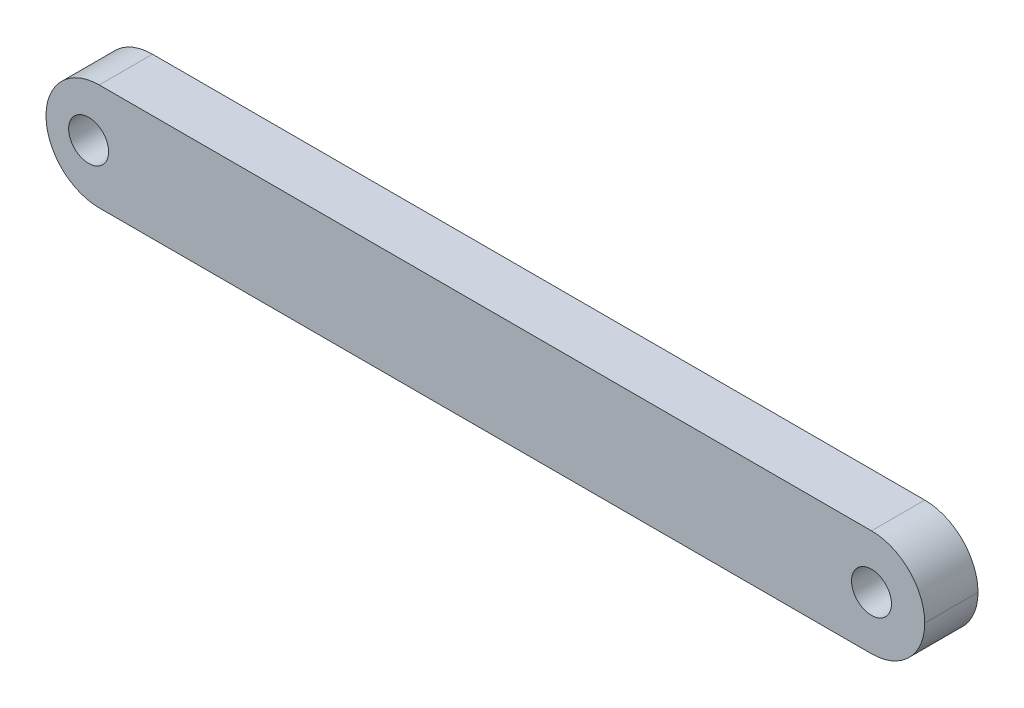
ISO-10303-21;
HEADER;
FILE_DESCRIPTION(('STEP AP214'),'2;1');
FILE_NAME('part.step','',(''),(''),'','','');
FILE_SCHEMA(('AUTOMOTIVE_DESIGN { 1 0 10303 214 1 1 1 1 }'));
ENDSEC;
DATA;
#1=APPLICATION_CONTEXT('core data for automotive mechanical design processes');
#2=APPLICATION_PROTOCOL_DEFINITION('international standard','automotive_design',2000,#1);
#3=PRODUCT_CONTEXT('',#1,'mechanical');
#4=PRODUCT('Part','Part','',(#3));
#5=PRODUCT_RELATED_PRODUCT_CATEGORY('part','',(#4));
#6=PRODUCT_DEFINITION_FORMATION('','',#4);
#7=PRODUCT_DEFINITION_CONTEXT('part definition',#1,'design');
#8=PRODUCT_DEFINITION('design','',#6,#7);
#9=PRODUCT_DEFINITION_SHAPE('','',#8);
#10=(LENGTH_UNIT() NAMED_UNIT(*) SI_UNIT(.MILLI.,.METRE.));
#11=(NAMED_UNIT(*) PLANE_ANGLE_UNIT() SI_UNIT($,.RADIAN.));
#12=(NAMED_UNIT(*) SI_UNIT($,.STERADIAN.) SOLID_ANGLE_UNIT());
#13=UNCERTAINTY_MEASURE_WITH_UNIT(LENGTH_MEASURE(1.E-05),#10,'distance_accuracy_value','');
#14=(GEOMETRIC_REPRESENTATION_CONTEXT(3) GLOBAL_UNCERTAINTY_ASSIGNED_CONTEXT((#13)) GLOBAL_UNIT_ASSIGNED_CONTEXT((#10,
#11,#12)) REPRESENTATION_CONTEXT('',''));
#15=CARTESIAN_POINT('',(0.,0.,0.));
#16=DIRECTION('',(0.,0.,1.));
#17=DIRECTION('',(1.,0.,0.));
#18=AXIS2_PLACEMENT_3D('',#15,#16,#17);
#19=CARTESIAN_POINT('',(104.775,12.7,6.34999999999999));
#20=DIRECTION('',(0.,0.,-1.));
#21=DIRECTION('',(-1.,0.,0.));
#22=AXIS2_PLACEMENT_3D('',#19,#20,#21);
#23=PLANE('',#22);
#24=CARTESIAN_POINT('',(92.075,0.,6.35));
#25=DIRECTION('',(0.,0.,1.));
#26=DIRECTION('',(1.,0.,0.));
#27=AXIS2_PLACEMENT_3D('',#24,#25,#26);
#28=CIRCLE('',#27,4.7625);
#29=CARTESIAN_POINT('',(96.8375,0.,6.35));
#30=VERTEX_POINT('',#29);
#31=EDGE_CURVE('E122',#30,#30,#28,.T.);
#32=ORIENTED_EDGE('',*,*,#31,.F.);
#33=EDGE_LOOP('',(#32));
#34=FACE_BOUND('',#33,.T.);
#35=CARTESIAN_POINT('',(-94.615,0.,6.35));
#36=DIRECTION('',(0.,0.,1.));
#37=DIRECTION('',(1.,0.,0.));
#38=AXIS2_PLACEMENT_3D('',#35,#36,#37);
#39=CIRCLE('',#38,4.7625);
#40=CARTESIAN_POINT('',(-89.8525,0.,6.35));
#41=VERTEX_POINT('',#40);
#42=EDGE_CURVE('E143',#41,#41,#39,.T.);
#43=ORIENTED_EDGE('',*,*,#42,.F.);
#44=EDGE_LOOP('',(#43));
#45=FACE_BOUND('',#44,.T.);
#46=CARTESIAN_POINT('',(-92.075,0.,6.35000000000001));
#47=DIRECTION('',(0.,0.,-1.));
#48=DIRECTION('',(-1.,0.,0.));
#49=AXIS2_PLACEMENT_3D('',#46,#47,#48);
#50=CIRCLE('',#49,12.7);
#51=CARTESIAN_POINT('',(-92.075,12.7,6.35000000000001));
#52=VERTEX_POINT('',#51);
#53=CARTESIAN_POINT('',(-104.775,0.,6.35000000000001));
#54=VERTEX_POINT('',#53);
#55=EDGE_CURVE('E93',#52,#54,#50,.F.);
#56=ORIENTED_EDGE('',*,*,#55,.T.);
#57=CARTESIAN_POINT('',(-92.075,0.,6.35000000000001));
#58=DIRECTION('',(0.,0.,-1.));
#59=DIRECTION('',(-1.,0.,0.));
#60=AXIS2_PLACEMENT_3D('',#57,#58,#59);
#61=CIRCLE('',#60,12.7);
#62=CARTESIAN_POINT('',(-92.075,-12.7,6.35000000000001));
#63=VERTEX_POINT('',#62);
#64=EDGE_CURVE('E88',#54,#63,#61,.F.);
#65=ORIENTED_EDGE('',*,*,#64,.T.);
#66=DIRECTION('',(1.,0.,0.));
#67=VECTOR('',#66,1.);
#68=CARTESIAN_POINT('',(104.775,-12.7,6.34999999999999));
#69=LINE('',#68,#67);
#70=CARTESIAN_POINT('',(92.0749999999999,-12.7,6.34999999999999));
#71=VERTEX_POINT('',#70);
#72=EDGE_CURVE('E90',#63,#71,#69,.T.);
#73=ORIENTED_EDGE('',*,*,#72,.T.);
#74=CARTESIAN_POINT('',(92.0749999999999,0.,6.34999999999999));
#75=DIRECTION('',(0.,0.,-1.));
#76=DIRECTION('',(-1.,0.,0.));
#77=AXIS2_PLACEMENT_3D('',#74,#75,#76);
#78=CIRCLE('',#77,12.7);
#79=CARTESIAN_POINT('',(104.775,0.,6.34999999999999));
#80=VERTEX_POINT('',#79);
#81=EDGE_CURVE('E157',#71,#80,#78,.F.);
#82=ORIENTED_EDGE('',*,*,#81,.T.);
#83=CARTESIAN_POINT('',(92.0749999999999,0.,6.34999999999999));
#84=DIRECTION('',(0.,0.,-1.));
#85=DIRECTION('',(-1.,0.,0.));
#86=AXIS2_PLACEMENT_3D('',#83,#84,#85);
#87=CIRCLE('',#86,12.7);
#88=CARTESIAN_POINT('',(92.0749999999999,12.7,6.34999999999999));
#89=VERTEX_POINT('',#88);
#90=EDGE_CURVE('E153',#80,#89,#87,.F.);
#91=ORIENTED_EDGE('',*,*,#90,.T.);
#92=DIRECTION('',(1.,0.,0.));
#93=VECTOR('',#92,1.);
#94=CARTESIAN_POINT('',(104.775,12.7,6.34999999999999));
#95=LINE('',#94,#93);
#96=EDGE_CURVE('E149',#52,#89,#95,.T.);
#97=ORIENTED_EDGE('',*,*,#96,.F.);
#98=EDGE_LOOP('',(#56,#65,#73,#82,#91,#97));
#99=FACE_BOUND('',#98,.T.);
#100=ADVANCED_FACE('F34',(#34,#45,#99),#23,.F.);
#101=CARTESIAN_POINT('',(104.775,12.7,-6.35000000000001));
#102=DIRECTION('',(0.,0.,1.));
#103=DIRECTION('',(1.,0.,0.));
#104=AXIS2_PLACEMENT_3D('',#101,#102,#103);
#105=PLANE('',#104);
#106=CARTESIAN_POINT('',(92.075,0.,-6.35000000000001));
#107=DIRECTION('',(0.,0.,1.));
#108=DIRECTION('',(1.,0.,0.));
#109=AXIS2_PLACEMENT_3D('',#106,#107,#108);
#110=CIRCLE('',#109,4.7625);
#111=CARTESIAN_POINT('',(96.8375,0.,-6.35000000000001));
#112=VERTEX_POINT('',#111);
#113=EDGE_CURVE('E124',#112,#112,#110,.T.);
#114=ORIENTED_EDGE('',*,*,#113,.T.);
#115=EDGE_LOOP('',(#114));
#116=FACE_BOUND('',#115,.T.);
#117=CARTESIAN_POINT('',(-94.615,0.,-6.35000000000001));
#118=DIRECTION('',(0.,0.,1.));
#119=DIRECTION('',(1.,0.,0.));
#120=AXIS2_PLACEMENT_3D('',#117,#118,#119);
#121=CIRCLE('',#120,4.7625);
#122=CARTESIAN_POINT('',(-89.8525,0.,-6.35000000000001));
#123=VERTEX_POINT('',#122);
#124=EDGE_CURVE('E109',#123,#123,#121,.T.);
#125=ORIENTED_EDGE('',*,*,#124,.T.);
#126=EDGE_LOOP('',(#125));
#127=FACE_BOUND('',#126,.T.);
#128=DIRECTION('',(-1.,0.,0.));
#129=VECTOR('',#128,1.);
#130=CARTESIAN_POINT('',(104.775,-12.7,-6.35000000000001));
#131=LINE('',#130,#129);
#132=CARTESIAN_POINT('',(92.0749999999999,-12.7,-6.35000000000001));
#133=VERTEX_POINT('',#132);
#134=CARTESIAN_POINT('',(-92.075,-12.7,-6.34999999999999));
#135=VERTEX_POINT('',#134);
#136=EDGE_CURVE('E108',#133,#135,#131,.T.);
#137=ORIENTED_EDGE('',*,*,#136,.T.);
#138=CARTESIAN_POINT('',(-92.075,0.,-6.34999999999999));
#139=DIRECTION('',(0.,0.,1.));
#140=DIRECTION('',(1.,0.,0.));
#141=AXIS2_PLACEMENT_3D('',#138,#139,#140);
#142=CIRCLE('',#141,12.7);
#143=CARTESIAN_POINT('',(-104.775,0.,-6.34999999999999));
#144=VERTEX_POINT('',#143);
#145=EDGE_CURVE('E112',#135,#144,#142,.F.);
#146=ORIENTED_EDGE('',*,*,#145,.T.);
#147=CARTESIAN_POINT('',(-92.075,0.,-6.34999999999999));
#148=DIRECTION('',(0.,0.,1.));
#149=DIRECTION('',(1.,0.,0.));
#150=AXIS2_PLACEMENT_3D('',#147,#148,#149);
#151=CIRCLE('',#150,12.7);
#152=CARTESIAN_POINT('',(-92.075,12.7,-6.34999999999999));
#153=VERTEX_POINT('',#152);
#154=EDGE_CURVE('E57',#144,#153,#151,.F.);
#155=ORIENTED_EDGE('',*,*,#154,.T.);
#156=DIRECTION('',(-1.,0.,0.));
#157=VECTOR('',#156,1.);
#158=CARTESIAN_POINT('',(104.775,12.7,-6.35000000000001));
#159=LINE('',#158,#157);
#160=CARTESIAN_POINT('',(92.0749999999999,12.7,-6.35000000000001));
#161=VERTEX_POINT('',#160);
#162=EDGE_CURVE('E152',#161,#153,#159,.T.);
#163=ORIENTED_EDGE('',*,*,#162,.F.);
#164=CARTESIAN_POINT('',(92.0749999999999,0.,-6.35000000000001));
#165=DIRECTION('',(0.,0.,1.));
#166=DIRECTION('',(1.,0.,0.));
#167=AXIS2_PLACEMENT_3D('',#164,#165,#166);
#168=CIRCLE('',#167,12.7);
#169=CARTESIAN_POINT('',(104.775,0.,-6.35000000000001));
#170=VERTEX_POINT('',#169);
#171=EDGE_CURVE('E51',#161,#170,#168,.F.);
#172=ORIENTED_EDGE('',*,*,#171,.T.);
#173=CARTESIAN_POINT('',(92.0749999999999,0.,-6.35000000000001));
#174=DIRECTION('',(0.,0.,1.));
#175=DIRECTION('',(1.,0.,0.));
#176=AXIS2_PLACEMENT_3D('',#173,#174,#175);
#177=CIRCLE('',#176,12.7);
#178=EDGE_CURVE('E114',#170,#133,#177,.F.);
#179=ORIENTED_EDGE('',*,*,#178,.T.);
#180=EDGE_LOOP('',(#137,#146,#155,#163,#172,#179));
#181=FACE_BOUND('',#180,.T.);
#182=ADVANCED_FACE('F165',(#116,#127,#181),#105,.F.);
#183=CARTESIAN_POINT('',(0.,12.7,0.));
#184=DIRECTION('',(0.,1.,0.));
#185=DIRECTION('',(0.,0.,1.));
#186=AXIS2_PLACEMENT_3D('',#183,#184,#185);
#187=PLANE('',#186);
#188=ORIENTED_EDGE('',*,*,#162,.T.);
#189=DIRECTION('',(0.,0.,1.));
#190=VECTOR('',#189,1.);
#191=CARTESIAN_POINT('',(-92.075,12.7,6.35000000000001));
#192=LINE('',#191,#190);
#193=EDGE_CURVE('E11',#153,#52,#192,.T.);
#194=ORIENTED_EDGE('',*,*,#193,.T.);
#195=ORIENTED_EDGE('',*,*,#96,.T.);
#196=DIRECTION('',(0.,0.,-1.));
#197=VECTOR('',#196,1.);
#198=CARTESIAN_POINT('',(92.0749999999999,12.7,-6.35000000000001));
#199=LINE('',#198,#197);
#200=EDGE_CURVE('E43',#89,#161,#199,.T.);
#201=ORIENTED_EDGE('',*,*,#200,.T.);
#202=EDGE_LOOP('',(#188,#194,#195,#201));
#203=FACE_BOUND('',#202,.T.);
#204=ADVANCED_FACE('F163',(#203),#187,.T.);
#205=CARTESIAN_POINT('',(0.,-12.7,0.));
#206=DIRECTION('',(0.,1.,0.));
#207=DIRECTION('',(0.,0.,1.));
#208=AXIS2_PLACEMENT_3D('',#205,#206,#207);
#209=PLANE('',#208);
#210=CARTESIAN_POINT('',(66.675,-12.7,0.));
#211=DIRECTION('',(0.,-1.,0.));
#212=DIRECTION('',(0.,0.,-1.));
#213=AXIS2_PLACEMENT_3D('',#210,#211,#212);
#214=CIRCLE('',#213,3.175);
#215=CARTESIAN_POINT('',(66.675,-12.7,-3.175));
#216=VERTEX_POINT('',#215);
#217=EDGE_CURVE('E139',#216,#216,#214,.T.);
#218=ORIENTED_EDGE('',*,*,#217,.F.);
#219=EDGE_LOOP('',(#218));
#220=FACE_BOUND('',#219,.T.);
#221=CARTESIAN_POINT('',(41.275,-12.7,0.));
#222=DIRECTION('',(0.,-1.,0.));
#223=DIRECTION('',(0.,0.,-1.));
#224=AXIS2_PLACEMENT_3D('',#221,#222,#223);
#225=CIRCLE('',#224,3.175);
#226=CARTESIAN_POINT('',(41.275,-12.7,-3.175));
#227=VERTEX_POINT('',#226);
#228=EDGE_CURVE('E131',#227,#227,#225,.T.);
#229=ORIENTED_EDGE('',*,*,#228,.F.);
#230=EDGE_LOOP('',(#229));
#231=FACE_BOUND('',#230,.T.);
#232=ORIENTED_EDGE('',*,*,#72,.F.);
#233=DIRECTION('',(0.,0.,1.));
#234=VECTOR('',#233,1.);
#235=CARTESIAN_POINT('',(-92.075,-12.7,0.));
#236=LINE('',#235,#234);
#237=EDGE_CURVE('E105',#63,#135,#236,.F.);
#238=ORIENTED_EDGE('',*,*,#237,.T.);
#239=ORIENTED_EDGE('',*,*,#136,.F.);
#240=DIRECTION('',(0.,0.,-1.));
#241=VECTOR('',#240,1.);
#242=CARTESIAN_POINT('',(92.0749999999999,-12.7,0.));
#243=LINE('',#242,#241);
#244=EDGE_CURVE('E98',#133,#71,#243,.F.);
#245=ORIENTED_EDGE('',*,*,#244,.T.);
#246=EDGE_LOOP('',(#232,#238,#239,#245));
#247=FACE_BOUND('',#246,.T.);
#248=ADVANCED_FACE('F103',(#220,#231,#247),#209,.F.);
#249=CARTESIAN_POINT('',(-94.615,0.,-6.35000000000001));
#250=DIRECTION('',(0.,0.,1.));
#251=DIRECTION('',(1.,0.,0.));
#252=AXIS2_PLACEMENT_3D('',#249,#250,#251);
#253=CYLINDRICAL_SURFACE('',#252,4.7625);
#254=ORIENTED_EDGE('',*,*,#124,.F.);
#255=EDGE_LOOP('',(#254));
#256=FACE_BOUND('',#255,.T.);
#257=ORIENTED_EDGE('',*,*,#42,.T.);
#258=EDGE_LOOP('',(#257));
#259=FACE_BOUND('',#258,.T.);
#260=ADVANCED_FACE('F212',(#256,#259),#253,.F.);
#261=CARTESIAN_POINT('',(92.075,0.,-6.35000000000001));
#262=DIRECTION('',(0.,0.,1.));
#263=DIRECTION('',(1.,0.,0.));
#264=AXIS2_PLACEMENT_3D('',#261,#262,#263);
#265=CYLINDRICAL_SURFACE('',#264,4.7625);
#266=ORIENTED_EDGE('',*,*,#113,.F.);
#267=EDGE_LOOP('',(#266));
#268=FACE_BOUND('',#267,.T.);
#269=ORIENTED_EDGE('',*,*,#31,.T.);
#270=EDGE_LOOP('',(#269));
#271=FACE_BOUND('',#270,.T.);
#272=ADVANCED_FACE('F183',(#268,#271),#265,.F.);
#273=CARTESIAN_POINT('',(-92.075,0.,0.));
#274=DIRECTION('',(0.,0.,-1.));
#275=DIRECTION('',(-1.,0.,0.));
#276=AXIS2_PLACEMENT_3D('',#273,#274,#275);
#277=CYLINDRICAL_SURFACE('',#276,12.7);
#278=ORIENTED_EDGE('',*,*,#193,.F.);
#279=ORIENTED_EDGE('',*,*,#154,.F.);
#280=DIRECTION('',(0.,0.,1.));
#281=VECTOR('',#280,1.);
#282=CARTESIAN_POINT('',(-104.775,0.,-6.34999999999999));
#283=LINE('',#282,#281);
#284=EDGE_CURVE('E121',#54,#144,#283,.F.);
#285=ORIENTED_EDGE('',*,*,#284,.F.);
#286=ORIENTED_EDGE('',*,*,#55,.F.);
#287=EDGE_LOOP('',(#278,#279,#285,#286));
#288=FACE_BOUND('',#287,.T.);
#289=ADVANCED_FACE('F181',(#288),#277,.T.);
#290=CARTESIAN_POINT('',(-92.075,0.,6.35000000000001));
#291=DIRECTION('',(0.,0.,1.));
#292=DIRECTION('',(1.,0.,0.));
#293=AXIS2_PLACEMENT_3D('',#290,#291,#292);
#294=CYLINDRICAL_SURFACE('',#293,12.7);
#295=ORIENTED_EDGE('',*,*,#145,.F.);
#296=ORIENTED_EDGE('',*,*,#237,.F.);
#297=ORIENTED_EDGE('',*,*,#64,.F.);
#298=ORIENTED_EDGE('',*,*,#284,.T.);
#299=EDGE_LOOP('',(#295,#296,#297,#298));
#300=FACE_BOUND('',#299,.T.);
#301=ADVANCED_FACE('F111',(#300),#294,.T.);
#302=CARTESIAN_POINT('',(92.0749999999999,0.,0.));
#303=DIRECTION('',(0.,0.,1.));
#304=DIRECTION('',(1.,0.,0.));
#305=AXIS2_PLACEMENT_3D('',#302,#303,#304);
#306=CYLINDRICAL_SURFACE('',#305,12.7);
#307=ORIENTED_EDGE('',*,*,#200,.F.);
#308=ORIENTED_EDGE('',*,*,#90,.F.);
#309=DIRECTION('',(0.,0.,-1.));
#310=VECTOR('',#309,1.);
#311=CARTESIAN_POINT('',(104.775,0.,6.34999999999999));
#312=LINE('',#311,#310);
#313=EDGE_CURVE('E38',#170,#80,#312,.F.);
#314=ORIENTED_EDGE('',*,*,#313,.F.);
#315=ORIENTED_EDGE('',*,*,#171,.F.);
#316=EDGE_LOOP('',(#307,#308,#314,#315));
#317=FACE_BOUND('',#316,.T.);
#318=ADVANCED_FACE('F36',(#317),#306,.T.);
#319=CARTESIAN_POINT('',(92.0749999999999,0.,6.34999999999999));
#320=DIRECTION('',(0.,0.,-1.));
#321=DIRECTION('',(-1.,0.,0.));
#322=AXIS2_PLACEMENT_3D('',#319,#320,#321);
#323=CYLINDRICAL_SURFACE('',#322,12.7);
#324=ORIENTED_EDGE('',*,*,#81,.F.);
#325=ORIENTED_EDGE('',*,*,#244,.F.);
#326=ORIENTED_EDGE('',*,*,#178,.F.);
#327=ORIENTED_EDGE('',*,*,#313,.T.);
#328=EDGE_LOOP('',(#324,#325,#326,#327));
#329=FACE_BOUND('',#328,.T.);
#330=ADVANCED_FACE('F185',(#329),#323,.T.);
#331=CARTESIAN_POINT('',(41.275,0.,0.));
#332=DIRECTION('',(0.,-1.,0.));
#333=DIRECTION('',(0.,0.,-1.));
#334=AXIS2_PLACEMENT_3D('',#331,#332,#333);
#335=CYLINDRICAL_SURFACE('',#334,3.175);
#336=CARTESIAN_POINT('',(41.275,0.,0.));
#337=DIRECTION('',(0.,-1.,0.));
#338=DIRECTION('',(0.,0.,-1.));
#339=AXIS2_PLACEMENT_3D('',#336,#337,#338);
#340=CIRCLE('',#339,3.175);
#341=CARTESIAN_POINT('',(41.275,0.,-3.175));
#342=VERTEX_POINT('',#341);
#343=EDGE_CURVE('E127',#342,#342,#340,.T.);
#344=ORIENTED_EDGE('',*,*,#343,.F.);
#345=EDGE_LOOP('',(#344));
#346=FACE_BOUND('',#345,.T.);
#347=ORIENTED_EDGE('',*,*,#228,.T.);
#348=EDGE_LOOP('',(#347));
#349=FACE_BOUND('',#348,.T.);
#350=ADVANCED_FACE('F187',(#346,#349),#335,.F.);
#351=CARTESIAN_POINT('',(41.275,0.,0.));
#352=DIRECTION('',(0.,-1.,0.));
#353=DIRECTION('',(0.,0.,-1.));
#354=AXIS2_PLACEMENT_3D('',#351,#352,#353);
#355=PLANE('',#354);
#356=ORIENTED_EDGE('',*,*,#343,.T.);
#357=EDGE_LOOP('',(#356));
#358=FACE_BOUND('',#357,.T.);
#359=ADVANCED_FACE('F192',(#358),#355,.T.);
#360=CARTESIAN_POINT('',(66.675,0.,0.));
#361=DIRECTION('',(0.,-1.,0.));
#362=DIRECTION('',(0.,0.,-1.));
#363=AXIS2_PLACEMENT_3D('',#360,#361,#362);
#364=CYLINDRICAL_SURFACE('',#363,3.175);
#365=CARTESIAN_POINT('',(66.675,0.,0.));
#366=DIRECTION('',(0.,-1.,0.));
#367=DIRECTION('',(0.,0.,-1.));
#368=AXIS2_PLACEMENT_3D('',#365,#366,#367);
#369=CIRCLE('',#368,3.175);
#370=CARTESIAN_POINT('',(66.675,0.,-3.175));
#371=VERTEX_POINT('',#370);
#372=EDGE_CURVE('E136',#371,#371,#369,.T.);
#373=ORIENTED_EDGE('',*,*,#372,.F.);
#374=EDGE_LOOP('',(#373));
#375=FACE_BOUND('',#374,.T.);
#376=ORIENTED_EDGE('',*,*,#217,.T.);
#377=EDGE_LOOP('',(#376));
#378=FACE_BOUND('',#377,.T.);
#379=ADVANCED_FACE('F271',(#375,#378),#364,.F.);
#380=CARTESIAN_POINT('',(66.675,0.,0.));
#381=DIRECTION('',(0.,-1.,0.));
#382=DIRECTION('',(0.,0.,-1.));
#383=AXIS2_PLACEMENT_3D('',#380,#381,#382);
#384=PLANE('',#383);
#385=ORIENTED_EDGE('',*,*,#372,.T.);
#386=EDGE_LOOP('',(#385));
#387=FACE_BOUND('',#386,.T.);
#388=ADVANCED_FACE('F279',(#387),#384,.T.);
#389=CLOSED_SHELL('',(#100,#182,#204,#248,#260,#272,#289,#301,#318,#330,#350,#359,#379,#388));
#390=MANIFOLD_SOLID_BREP('B2',#389);
#391=ADVANCED_BREP_SHAPE_REPRESENTATION('',(#18,#390),#14);
#392=SHAPE_DEFINITION_REPRESENTATION(#9,#391);
ENDSEC;
END-ISO-10303-21;
